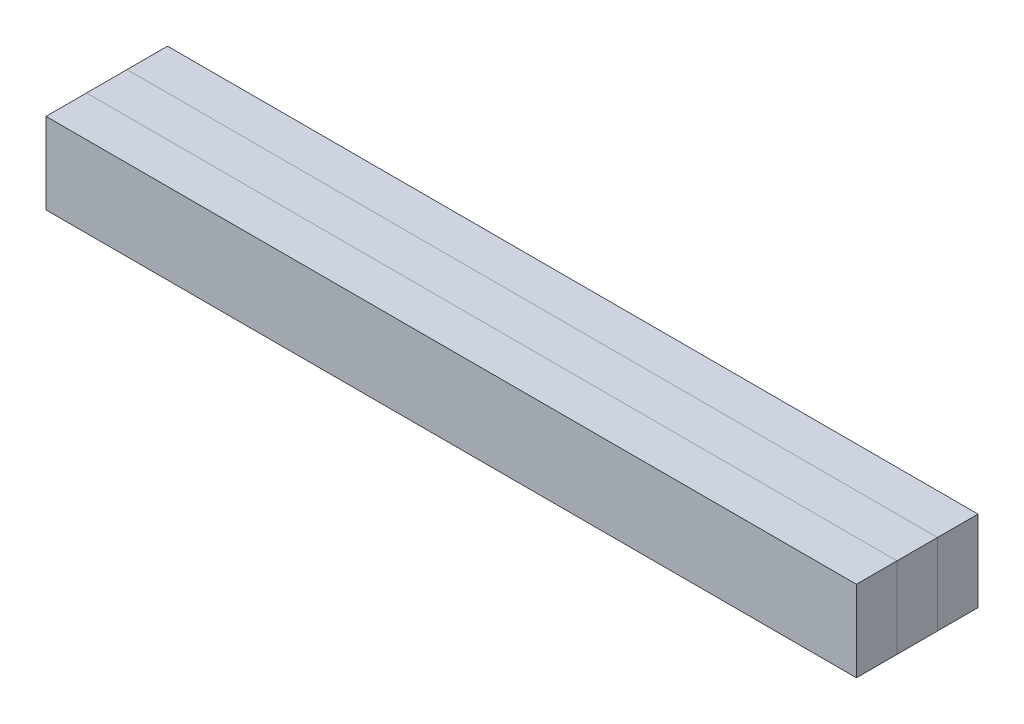
ISO-10303-21;
HEADER;
FILE_DESCRIPTION(('STEP AP214'),'2;1');
FILE_NAME('part.step','',(''),(''),'','','');
FILE_SCHEMA(('AUTOMOTIVE_DESIGN { 1 0 10303 214 1 1 1 1 }'));
ENDSEC;
DATA;
#1=APPLICATION_CONTEXT('core data for automotive mechanical design processes');
#2=APPLICATION_PROTOCOL_DEFINITION('international standard','automotive_design',2000,#1);
#3=PRODUCT_CONTEXT('',#1,'mechanical');
#4=PRODUCT('Part','Part','',(#3));
#5=PRODUCT_RELATED_PRODUCT_CATEGORY('part','',(#4));
#6=PRODUCT_DEFINITION_FORMATION('','',#4);
#7=PRODUCT_DEFINITION_CONTEXT('part definition',#1,'design');
#8=PRODUCT_DEFINITION('design','',#6,#7);
#9=PRODUCT_DEFINITION_SHAPE('','',#8);
#10=(LENGTH_UNIT() NAMED_UNIT(*) SI_UNIT(.MILLI.,.METRE.));
#11=(NAMED_UNIT(*) PLANE_ANGLE_UNIT() SI_UNIT($,.RADIAN.));
#12=(NAMED_UNIT(*) SI_UNIT($,.STERADIAN.) SOLID_ANGLE_UNIT());
#13=UNCERTAINTY_MEASURE_WITH_UNIT(LENGTH_MEASURE(1.E-05),#10,'distance_accuracy_value','');
#14=(GEOMETRIC_REPRESENTATION_CONTEXT(3) GLOBAL_UNCERTAINTY_ASSIGNED_CONTEXT((#13)) GLOBAL_UNIT_ASSIGNED_CONTEXT((#10,
#11,#12)) REPRESENTATION_CONTEXT('',''));
#15=CARTESIAN_POINT('',(0.,0.,0.));
#16=DIRECTION('',(0.,0.,1.));
#17=DIRECTION('',(1.,0.,0.));
#18=AXIS2_PLACEMENT_3D('',#15,#16,#17);
#19=CARTESIAN_POINT('',(0.,0.,-10.));
#20=DIRECTION('',(1.,0.,0.));
#21=DIRECTION('',(0.,0.,-1.));
#22=AXIS2_PLACEMENT_3D('',#19,#20,#21);
#23=PLANE('',#22);
#24=DIRECTION('',(0.,1.,0.));
#25=VECTOR('',#24,1.);
#26=CARTESIAN_POINT('',(0.,0.,-5.));
#27=LINE('',#26,#25);
#28=CARTESIAN_POINT('',(0.,0.,-5.));
#29=VERTEX_POINT('',#28);
#30=CARTESIAN_POINT('',(0.,10.,-5.));
#31=VERTEX_POINT('',#30);
#32=EDGE_CURVE('E115',#29,#31,#27,.T.);
#33=ORIENTED_EDGE('',*,*,#32,.T.);
#34=DIRECTION('',(0.,0.,1.));
#35=VECTOR('',#34,1.);
#36=CARTESIAN_POINT('',(0.,10.,-10.));
#37=LINE('',#36,#35);
#38=CARTESIAN_POINT('',(0.,10.,-10.));
#39=VERTEX_POINT('',#38);
#40=EDGE_CURVE('E12',#39,#31,#37,.T.);
#41=ORIENTED_EDGE('',*,*,#40,.F.);
#42=DIRECTION('',(0.,1.,0.));
#43=VECTOR('',#42,1.);
#44=CARTESIAN_POINT('',(0.,0.,-10.));
#45=LINE('',#44,#43);
#46=CARTESIAN_POINT('',(0.,0.,-10.));
#47=VERTEX_POINT('',#46);
#48=EDGE_CURVE('E103',#47,#39,#45,.T.);
#49=ORIENTED_EDGE('',*,*,#48,.F.);
#50=DIRECTION('',(0.,0.,1.));
#51=VECTOR('',#50,1.);
#52=CARTESIAN_POINT('',(0.,0.,-10.));
#53=LINE('',#52,#51);
#54=EDGE_CURVE('E111',#47,#29,#53,.T.);
#55=ORIENTED_EDGE('',*,*,#54,.T.);
#56=EDGE_LOOP('',(#33,#41,#49,#55));
#57=FACE_BOUND('',#56,.T.);
#58=ADVANCED_FACE('F52',(#57),#23,.F.);
#59=CARTESIAN_POINT('',(0.,10.,-10.));
#60=DIRECTION('',(0.,-1.,0.));
#61=DIRECTION('',(0.,0.,-1.));
#62=AXIS2_PLACEMENT_3D('',#59,#60,#61);
#63=PLANE('',#62);
#64=DIRECTION('',(1.,0.,0.));
#65=VECTOR('',#64,1.);
#66=CARTESIAN_POINT('',(0.,10.,-5.));
#67=LINE('',#66,#65);
#68=CARTESIAN_POINT('',(100.,10.,-5.));
#69=VERTEX_POINT('',#68);
#70=EDGE_CURVE('E107',#31,#69,#67,.T.);
#71=ORIENTED_EDGE('',*,*,#70,.T.);
#72=DIRECTION('',(0.,0.,1.));
#73=VECTOR('',#72,1.);
#74=CARTESIAN_POINT('',(100.,10.,-10.));
#75=LINE('',#74,#73);
#76=CARTESIAN_POINT('',(100.,10.,-10.));
#77=VERTEX_POINT('',#76);
#78=EDGE_CURVE('E60',#77,#69,#75,.T.);
#79=ORIENTED_EDGE('',*,*,#78,.F.);
#80=DIRECTION('',(1.,0.,0.));
#81=VECTOR('',#80,1.);
#82=CARTESIAN_POINT('',(0.,10.,-10.));
#83=LINE('',#82,#81);
#84=EDGE_CURVE('E98',#39,#77,#83,.T.);
#85=ORIENTED_EDGE('',*,*,#84,.F.);
#86=ORIENTED_EDGE('',*,*,#40,.T.);
#87=EDGE_LOOP('',(#71,#79,#85,#86));
#88=FACE_BOUND('',#87,.T.);
#89=ADVANCED_FACE('F106',(#88),#63,.F.);
#90=CARTESIAN_POINT('',(100.,0.,-10.));
#91=DIRECTION('',(-1.,0.,0.));
#92=DIRECTION('',(0.,0.,1.));
#93=AXIS2_PLACEMENT_3D('',#90,#91,#92);
#94=PLANE('',#93);
#95=DIRECTION('',(0.,-1.,0.));
#96=VECTOR('',#95,1.);
#97=CARTESIAN_POINT('',(100.,0.,-5.));
#98=LINE('',#97,#96);
#99=CARTESIAN_POINT('',(100.,0.,-5.));
#100=VERTEX_POINT('',#99);
#101=EDGE_CURVE('E85',#69,#100,#98,.T.);
#102=ORIENTED_EDGE('',*,*,#101,.T.);
#103=DIRECTION('',(0.,0.,1.));
#104=VECTOR('',#103,1.);
#105=CARTESIAN_POINT('',(100.,0.,-10.));
#106=LINE('',#105,#104);
#107=CARTESIAN_POINT('',(100.,0.,-10.));
#108=VERTEX_POINT('',#107);
#109=EDGE_CURVE('E108',#108,#100,#106,.T.);
#110=ORIENTED_EDGE('',*,*,#109,.F.);
#111=DIRECTION('',(0.,-1.,0.));
#112=VECTOR('',#111,1.);
#113=CARTESIAN_POINT('',(100.,0.,-10.));
#114=LINE('',#113,#112);
#115=EDGE_CURVE('E101',#77,#108,#114,.T.);
#116=ORIENTED_EDGE('',*,*,#115,.F.);
#117=ORIENTED_EDGE('',*,*,#78,.T.);
#118=EDGE_LOOP('',(#102,#110,#116,#117));
#119=FACE_BOUND('',#118,.T.);
#120=ADVANCED_FACE('F109',(#119),#94,.F.);
#121=CARTESIAN_POINT('',(0.,0.,-10.));
#122=DIRECTION('',(0.,1.,0.));
#123=DIRECTION('',(0.,0.,1.));
#124=AXIS2_PLACEMENT_3D('',#121,#122,#123);
#125=PLANE('',#124);
#126=DIRECTION('',(-1.,0.,0.));
#127=VECTOR('',#126,1.);
#128=CARTESIAN_POINT('',(0.,0.,-5.));
#129=LINE('',#128,#127);
#130=EDGE_CURVE('E91',#100,#29,#129,.T.);
#131=ORIENTED_EDGE('',*,*,#130,.T.);
#132=ORIENTED_EDGE('',*,*,#54,.F.);
#133=DIRECTION('',(-1.,0.,0.));
#134=VECTOR('',#133,1.);
#135=CARTESIAN_POINT('',(0.,0.,-10.));
#136=LINE('',#135,#134);
#137=EDGE_CURVE('E68',#108,#47,#136,.T.);
#138=ORIENTED_EDGE('',*,*,#137,.F.);
#139=ORIENTED_EDGE('',*,*,#109,.T.);
#140=EDGE_LOOP('',(#131,#132,#138,#139));
#141=FACE_BOUND('',#140,.T.);
#142=ADVANCED_FACE('F122',(#141),#125,.F.);
#143=CARTESIAN_POINT('',(0.,0.,-10.));
#144=DIRECTION('',(0.,0.,-1.));
#145=DIRECTION('',(-1.,0.,0.));
#146=AXIS2_PLACEMENT_3D('',#143,#144,#145);
#147=PLANE('',#146);
#148=ORIENTED_EDGE('',*,*,#48,.T.);
#149=ORIENTED_EDGE('',*,*,#84,.T.);
#150=ORIENTED_EDGE('',*,*,#115,.T.);
#151=ORIENTED_EDGE('',*,*,#137,.T.);
#152=EDGE_LOOP('',(#148,#149,#150,#151));
#153=FACE_BOUND('',#152,.T.);
#154=ADVANCED_FACE('F99',(#153),#147,.T.);
#155=CARTESIAN_POINT('',(0.,0.,-5.));
#156=DIRECTION('',(0.,0.,-1.));
#157=DIRECTION('',(-1.,0.,0.));
#158=AXIS2_PLACEMENT_3D('',#155,#156,#157);
#159=PLANE('',#158);
#160=ORIENTED_EDGE('',*,*,#32,.F.);
#161=ORIENTED_EDGE('',*,*,#130,.F.);
#162=ORIENTED_EDGE('',*,*,#101,.F.);
#163=ORIENTED_EDGE('',*,*,#70,.F.);
#164=EDGE_LOOP('',(#160,#161,#162,#163));
#165=FACE_BOUND('',#164,.T.);
#166=ADVANCED_FACE('F125',(#165),#159,.F.);
#167=CLOSED_SHELL('',(#58,#89,#120,#142,#154,#166));
#168=MANIFOLD_SOLID_BREP('B2',#167);
#169=CARTESIAN_POINT('',(0.,0.,-5.));
#170=DIRECTION('',(1.,0.,0.));
#171=DIRECTION('',(0.,0.,-1.));
#172=AXIS2_PLACEMENT_3D('',#169,#170,#171);
#173=PLANE('',#172);
#174=DIRECTION('',(0.,1.,0.));
#175=VECTOR('',#174,1.);
#176=CARTESIAN_POINT('',(0.,0.,0.));
#177=LINE('',#176,#175);
#178=CARTESIAN_POINT('',(0.,0.,0.));
#179=VERTEX_POINT('',#178);
#180=CARTESIAN_POINT('',(0.,10.,0.));
#181=VERTEX_POINT('',#180);
#182=EDGE_CURVE('E253',#179,#181,#177,.T.);
#183=ORIENTED_EDGE('',*,*,#182,.T.);
#184=DIRECTION('',(0.,0.,1.));
#185=VECTOR('',#184,1.);
#186=CARTESIAN_POINT('',(0.,10.,-5.));
#187=LINE('',#186,#185);
#188=CARTESIAN_POINT('',(0.,10.,-5.));
#189=VERTEX_POINT('',#188);
#190=EDGE_CURVE('E50',#189,#181,#187,.T.);
#191=ORIENTED_EDGE('',*,*,#190,.F.);
#192=DIRECTION('',(0.,1.,0.));
#193=VECTOR('',#192,1.);
#194=CARTESIAN_POINT('',(0.,0.,-5.));
#195=LINE('',#194,#193);
#196=CARTESIAN_POINT('',(0.,0.,-5.));
#197=VERTEX_POINT('',#196);
#198=EDGE_CURVE('E241',#197,#189,#195,.T.);
#199=ORIENTED_EDGE('',*,*,#198,.F.);
#200=DIRECTION('',(0.,0.,1.));
#201=VECTOR('',#200,1.);
#202=CARTESIAN_POINT('',(0.,0.,-5.));
#203=LINE('',#202,#201);
#204=EDGE_CURVE('E249',#197,#179,#203,.T.);
#205=ORIENTED_EDGE('',*,*,#204,.T.);
#206=EDGE_LOOP('',(#183,#191,#199,#205));
#207=FACE_BOUND('',#206,.T.);
#208=ADVANCED_FACE('F190',(#207),#173,.F.);
#209=CARTESIAN_POINT('',(0.,10.,-5.));
#210=DIRECTION('',(0.,-1.,0.));
#211=DIRECTION('',(0.,0.,-1.));
#212=AXIS2_PLACEMENT_3D('',#209,#210,#211);
#213=PLANE('',#212);
#214=DIRECTION('',(1.,0.,0.));
#215=VECTOR('',#214,1.);
#216=CARTESIAN_POINT('',(0.,10.,0.));
#217=LINE('',#216,#215);
#218=CARTESIAN_POINT('',(100.,10.,0.));
#219=VERTEX_POINT('',#218);
#220=EDGE_CURVE('E245',#181,#219,#217,.T.);
#221=ORIENTED_EDGE('',*,*,#220,.T.);
#222=DIRECTION('',(0.,0.,1.));
#223=VECTOR('',#222,1.);
#224=CARTESIAN_POINT('',(100.,10.,-5.));
#225=LINE('',#224,#223);
#226=CARTESIAN_POINT('',(100.,10.,-5.));
#227=VERTEX_POINT('',#226);
#228=EDGE_CURVE('E198',#227,#219,#225,.T.);
#229=ORIENTED_EDGE('',*,*,#228,.F.);
#230=DIRECTION('',(1.,0.,0.));
#231=VECTOR('',#230,1.);
#232=CARTESIAN_POINT('',(0.,10.,-5.));
#233=LINE('',#232,#231);
#234=EDGE_CURVE('E236',#189,#227,#233,.T.);
#235=ORIENTED_EDGE('',*,*,#234,.F.);
#236=ORIENTED_EDGE('',*,*,#190,.T.);
#237=EDGE_LOOP('',(#221,#229,#235,#236));
#238=FACE_BOUND('',#237,.T.);
#239=ADVANCED_FACE('F244',(#238),#213,.F.);
#240=CARTESIAN_POINT('',(100.,0.,-5.));
#241=DIRECTION('',(-1.,0.,0.));
#242=DIRECTION('',(0.,0.,1.));
#243=AXIS2_PLACEMENT_3D('',#240,#241,#242);
#244=PLANE('',#243);
#245=DIRECTION('',(0.,-1.,0.));
#246=VECTOR('',#245,1.);
#247=CARTESIAN_POINT('',(100.,0.,0.));
#248=LINE('',#247,#246);
#249=CARTESIAN_POINT('',(100.,0.,0.));
#250=VERTEX_POINT('',#249);
#251=EDGE_CURVE('E223',#219,#250,#248,.T.);
#252=ORIENTED_EDGE('',*,*,#251,.T.);
#253=DIRECTION('',(0.,0.,1.));
#254=VECTOR('',#253,1.);
#255=CARTESIAN_POINT('',(100.,0.,-5.));
#256=LINE('',#255,#254);
#257=CARTESIAN_POINT('',(100.,0.,-5.));
#258=VERTEX_POINT('',#257);
#259=EDGE_CURVE('E246',#258,#250,#256,.T.);
#260=ORIENTED_EDGE('',*,*,#259,.F.);
#261=DIRECTION('',(0.,-1.,0.));
#262=VECTOR('',#261,1.);
#263=CARTESIAN_POINT('',(100.,0.,-5.));
#264=LINE('',#263,#262);
#265=EDGE_CURVE('E239',#227,#258,#264,.T.);
#266=ORIENTED_EDGE('',*,*,#265,.F.);
#267=ORIENTED_EDGE('',*,*,#228,.T.);
#268=EDGE_LOOP('',(#252,#260,#266,#267));
#269=FACE_BOUND('',#268,.T.);
#270=ADVANCED_FACE('F247',(#269),#244,.F.);
#271=CARTESIAN_POINT('',(0.,0.,-5.));
#272=DIRECTION('',(0.,1.,0.));
#273=DIRECTION('',(0.,0.,1.));
#274=AXIS2_PLACEMENT_3D('',#271,#272,#273);
#275=PLANE('',#274);
#276=DIRECTION('',(-1.,0.,0.));
#277=VECTOR('',#276,1.);
#278=CARTESIAN_POINT('',(0.,0.,0.));
#279=LINE('',#278,#277);
#280=EDGE_CURVE('E229',#250,#179,#279,.T.);
#281=ORIENTED_EDGE('',*,*,#280,.T.);
#282=ORIENTED_EDGE('',*,*,#204,.F.);
#283=DIRECTION('',(-1.,0.,0.));
#284=VECTOR('',#283,1.);
#285=CARTESIAN_POINT('',(0.,0.,-5.));
#286=LINE('',#285,#284);
#287=EDGE_CURVE('E206',#258,#197,#286,.T.);
#288=ORIENTED_EDGE('',*,*,#287,.F.);
#289=ORIENTED_EDGE('',*,*,#259,.T.);
#290=EDGE_LOOP('',(#281,#282,#288,#289));
#291=FACE_BOUND('',#290,.T.);
#292=ADVANCED_FACE('F260',(#291),#275,.F.);
#293=CARTESIAN_POINT('',(0.,0.,-5.));
#294=DIRECTION('',(0.,0.,-1.));
#295=DIRECTION('',(-1.,0.,0.));
#296=AXIS2_PLACEMENT_3D('',#293,#294,#295);
#297=PLANE('',#296);
#298=ORIENTED_EDGE('',*,*,#198,.T.);
#299=ORIENTED_EDGE('',*,*,#234,.T.);
#300=ORIENTED_EDGE('',*,*,#265,.T.);
#301=ORIENTED_EDGE('',*,*,#287,.T.);
#302=EDGE_LOOP('',(#298,#299,#300,#301));
#303=FACE_BOUND('',#302,.T.);
#304=ADVANCED_FACE('F237',(#303),#297,.T.);
#305=CARTESIAN_POINT('',(0.,0.,0.));
#306=DIRECTION('',(0.,0.,-1.));
#307=DIRECTION('',(-1.,0.,0.));
#308=AXIS2_PLACEMENT_3D('',#305,#306,#307);
#309=PLANE('',#308);
#310=ORIENTED_EDGE('',*,*,#182,.F.);
#311=ORIENTED_EDGE('',*,*,#280,.F.);
#312=ORIENTED_EDGE('',*,*,#251,.F.);
#313=ORIENTED_EDGE('',*,*,#220,.F.);
#314=EDGE_LOOP('',(#310,#311,#312,#313));
#315=FACE_BOUND('',#314,.T.);
#316=ADVANCED_FACE('F263',(#315),#309,.F.);
#317=CLOSED_SHELL('',(#208,#239,#270,#292,#304,#316));
#318=MANIFOLD_SOLID_BREP('B6',#317);
#319=CARTESIAN_POINT('',(0.,0.,5.));
#320=DIRECTION('',(1.,0.,0.));
#321=DIRECTION('',(0.,0.,-1.));
#322=AXIS2_PLACEMENT_3D('',#319,#320,#321);
#323=PLANE('',#322);
#324=DIRECTION('',(0.,-1.,0.));
#325=VECTOR('',#324,1.);
#326=CARTESIAN_POINT('',(0.,0.,0.));
#327=LINE('',#326,#325);
#328=CARTESIAN_POINT('',(0.,10.,0.));
#329=VERTEX_POINT('',#328);
#330=CARTESIAN_POINT('',(0.,0.,0.));
#331=VERTEX_POINT('',#330);
#332=EDGE_CURVE('E381',#329,#331,#327,.T.);
#333=ORIENTED_EDGE('',*,*,#332,.T.);
#334=DIRECTION('',(0.,0.,-1.));
#335=VECTOR('',#334,1.);
#336=CARTESIAN_POINT('',(0.,0.,5.));
#337=LINE('',#336,#335);
#338=CARTESIAN_POINT('',(0.,0.,5.));
#339=VERTEX_POINT('',#338);
#340=EDGE_CURVE('E188',#339,#331,#337,.T.);
#341=ORIENTED_EDGE('',*,*,#340,.F.);
#342=DIRECTION('',(0.,-1.,0.));
#343=VECTOR('',#342,1.);
#344=CARTESIAN_POINT('',(0.,0.,5.));
#345=LINE('',#344,#343);
#346=CARTESIAN_POINT('',(0.,10.,5.));
#347=VERTEX_POINT('',#346);
#348=EDGE_CURVE('E369',#347,#339,#345,.T.);
#349=ORIENTED_EDGE('',*,*,#348,.F.);
#350=DIRECTION('',(0.,0.,-1.));
#351=VECTOR('',#350,1.);
#352=CARTESIAN_POINT('',(0.,10.,5.));
#353=LINE('',#352,#351);
#354=EDGE_CURVE('E377',#347,#329,#353,.T.);
#355=ORIENTED_EDGE('',*,*,#354,.T.);
#356=EDGE_LOOP('',(#333,#341,#349,#355));
#357=FACE_BOUND('',#356,.T.);
#358=ADVANCED_FACE('F318',(#357),#323,.F.);
#359=CARTESIAN_POINT('',(0.,0.,5.));
#360=DIRECTION('',(0.,1.,0.));
#361=DIRECTION('',(0.,0.,1.));
#362=AXIS2_PLACEMENT_3D('',#359,#360,#361);
#363=PLANE('',#362);
#364=DIRECTION('',(1.,0.,0.));
#365=VECTOR('',#364,1.);
#366=CARTESIAN_POINT('',(0.,0.,0.));
#367=LINE('',#366,#365);
#368=CARTESIAN_POINT('',(100.,0.,0.));
#369=VERTEX_POINT('',#368);
#370=EDGE_CURVE('E373',#331,#369,#367,.T.);
#371=ORIENTED_EDGE('',*,*,#370,.T.);
#372=DIRECTION('',(0.,0.,-1.));
#373=VECTOR('',#372,1.);
#374=CARTESIAN_POINT('',(100.,0.,5.));
#375=LINE('',#374,#373);
#376=CARTESIAN_POINT('',(100.,0.,5.));
#377=VERTEX_POINT('',#376);
#378=EDGE_CURVE('E326',#377,#369,#375,.T.);
#379=ORIENTED_EDGE('',*,*,#378,.F.);
#380=DIRECTION('',(1.,0.,0.));
#381=VECTOR('',#380,1.);
#382=CARTESIAN_POINT('',(0.,0.,5.));
#383=LINE('',#382,#381);
#384=EDGE_CURVE('E364',#339,#377,#383,.T.);
#385=ORIENTED_EDGE('',*,*,#384,.F.);
#386=ORIENTED_EDGE('',*,*,#340,.T.);
#387=EDGE_LOOP('',(#371,#379,#385,#386));
#388=FACE_BOUND('',#387,.T.);
#389=ADVANCED_FACE('F372',(#388),#363,.F.);
#390=CARTESIAN_POINT('',(100.,0.,5.));
#391=DIRECTION('',(-1.,0.,0.));
#392=DIRECTION('',(0.,0.,1.));
#393=AXIS2_PLACEMENT_3D('',#390,#391,#392);
#394=PLANE('',#393);
#395=DIRECTION('',(0.,1.,0.));
#396=VECTOR('',#395,1.);
#397=CARTESIAN_POINT('',(100.,0.,0.));
#398=LINE('',#397,#396);
#399=CARTESIAN_POINT('',(100.,10.,0.));
#400=VERTEX_POINT('',#399);
#401=EDGE_CURVE('E351',#369,#400,#398,.T.);
#402=ORIENTED_EDGE('',*,*,#401,.T.);
#403=DIRECTION('',(0.,0.,-1.));
#404=VECTOR('',#403,1.);
#405=CARTESIAN_POINT('',(100.,10.,5.));
#406=LINE('',#405,#404);
#407=CARTESIAN_POINT('',(100.,10.,5.));
#408=VERTEX_POINT('',#407);
#409=EDGE_CURVE('E374',#408,#400,#406,.T.);
#410=ORIENTED_EDGE('',*,*,#409,.F.);
#411=DIRECTION('',(0.,1.,0.));
#412=VECTOR('',#411,1.);
#413=CARTESIAN_POINT('',(100.,0.,5.));
#414=LINE('',#413,#412);
#415=EDGE_CURVE('E367',#377,#408,#414,.T.);
#416=ORIENTED_EDGE('',*,*,#415,.F.);
#417=ORIENTED_EDGE('',*,*,#378,.T.);
#418=EDGE_LOOP('',(#402,#410,#416,#417));
#419=FACE_BOUND('',#418,.T.);
#420=ADVANCED_FACE('F375',(#419),#394,.F.);
#421=CARTESIAN_POINT('',(0.,10.,5.));
#422=DIRECTION('',(0.,-1.,0.));
#423=DIRECTION('',(0.,0.,-1.));
#424=AXIS2_PLACEMENT_3D('',#421,#422,#423);
#425=PLANE('',#424);
#426=DIRECTION('',(-1.,0.,0.));
#427=VECTOR('',#426,1.);
#428=CARTESIAN_POINT('',(0.,10.,0.));
#429=LINE('',#428,#427);
#430=EDGE_CURVE('E357',#400,#329,#429,.T.);
#431=ORIENTED_EDGE('',*,*,#430,.T.);
#432=ORIENTED_EDGE('',*,*,#354,.F.);
#433=DIRECTION('',(-1.,0.,0.));
#434=VECTOR('',#433,1.);
#435=CARTESIAN_POINT('',(0.,10.,5.));
#436=LINE('',#435,#434);
#437=EDGE_CURVE('E334',#408,#347,#436,.T.);
#438=ORIENTED_EDGE('',*,*,#437,.F.);
#439=ORIENTED_EDGE('',*,*,#409,.T.);
#440=EDGE_LOOP('',(#431,#432,#438,#439));
#441=FACE_BOUND('',#440,.T.);
#442=ADVANCED_FACE('F388',(#441),#425,.F.);
#443=CARTESIAN_POINT('',(0.,0.,5.));
#444=DIRECTION('',(0.,0.,-1.));
#445=DIRECTION('',(-1.,0.,0.));
#446=AXIS2_PLACEMENT_3D('',#443,#444,#445);
#447=PLANE('',#446);
#448=ORIENTED_EDGE('',*,*,#348,.T.);
#449=ORIENTED_EDGE('',*,*,#384,.T.);
#450=ORIENTED_EDGE('',*,*,#415,.T.);
#451=ORIENTED_EDGE('',*,*,#437,.T.);
#452=EDGE_LOOP('',(#448,#449,#450,#451));
#453=FACE_BOUND('',#452,.T.);
#454=ADVANCED_FACE('F365',(#453),#447,.F.);
#455=CARTESIAN_POINT('',(0.,0.,0.));
#456=DIRECTION('',(0.,0.,-1.));
#457=DIRECTION('',(-1.,0.,0.));
#458=AXIS2_PLACEMENT_3D('',#455,#456,#457);
#459=PLANE('',#458);
#460=ORIENTED_EDGE('',*,*,#332,.F.);
#461=ORIENTED_EDGE('',*,*,#430,.F.);
#462=ORIENTED_EDGE('',*,*,#401,.F.);
#463=ORIENTED_EDGE('',*,*,#370,.F.);
#464=EDGE_LOOP('',(#460,#461,#462,#463));
#465=FACE_BOUND('',#464,.T.);
#466=ADVANCED_FACE('F391',(#465),#459,.T.);
#467=CLOSED_SHELL('',(#358,#389,#420,#442,#454,#466));
#468=MANIFOLD_SOLID_BREP('B44',#467);
#469=ADVANCED_BREP_SHAPE_REPRESENTATION('',(#18,#168,#318,#468),#14);
#470=SHAPE_DEFINITION_REPRESENTATION(#9,#469);
ENDSEC;
END-ISO-10303-21;
